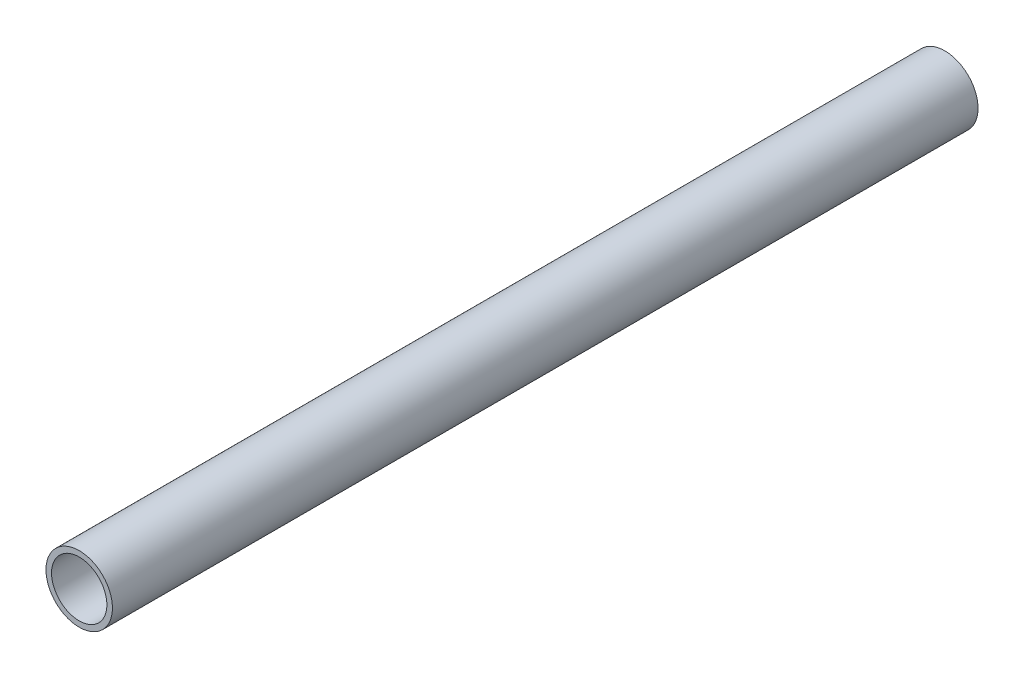
ISO-10303-21;
HEADER;
FILE_DESCRIPTION(('STEP AP214'),'2;1');
FILE_NAME('part.step','',(''),(''),'','','');
FILE_SCHEMA(('AUTOMOTIVE_DESIGN { 1 0 10303 214 1 1 1 1 }'));
ENDSEC;
DATA;
#1=APPLICATION_CONTEXT('core data for automotive mechanical design processes');
#2=APPLICATION_PROTOCOL_DEFINITION('international standard','automotive_design',2000,#1);
#3=PRODUCT_CONTEXT('',#1,'mechanical');
#4=PRODUCT('Part','Part','',(#3));
#5=PRODUCT_RELATED_PRODUCT_CATEGORY('part','',(#4));
#6=PRODUCT_DEFINITION_FORMATION('','',#4);
#7=PRODUCT_DEFINITION_CONTEXT('part definition',#1,'design');
#8=PRODUCT_DEFINITION('design','',#6,#7);
#9=PRODUCT_DEFINITION_SHAPE('','',#8);
#10=(LENGTH_UNIT() NAMED_UNIT(*) SI_UNIT(.MILLI.,.METRE.));
#11=(NAMED_UNIT(*) PLANE_ANGLE_UNIT() SI_UNIT($,.RADIAN.));
#12=(NAMED_UNIT(*) SI_UNIT($,.STERADIAN.) SOLID_ANGLE_UNIT());
#13=UNCERTAINTY_MEASURE_WITH_UNIT(LENGTH_MEASURE(1.E-05),#10,'distance_accuracy_value','');
#14=(GEOMETRIC_REPRESENTATION_CONTEXT(3) GLOBAL_UNCERTAINTY_ASSIGNED_CONTEXT((#13)) GLOBAL_UNIT_ASSIGNED_CONTEXT((#10,
#11,#12)) REPRESENTATION_CONTEXT('',''));
#15=CARTESIAN_POINT('',(0.,0.,0.));
#16=DIRECTION('',(0.,0.,1.));
#17=DIRECTION('',(1.,0.,0.));
#18=AXIS2_PLACEMENT_3D('',#15,#16,#17);
#19=CARTESIAN_POINT('',(0.,0.,391.));
#20=DIRECTION('',(0.,0.,1.));
#21=DIRECTION('',(1.,0.,0.));
#22=AXIS2_PLACEMENT_3D('',#19,#20,#21);
#23=PLANE('',#22);
#24=CARTESIAN_POINT('',(0.,0.,391.));
#25=DIRECTION('',(0.,0.,1.));
#26=DIRECTION('',(1.,0.,0.));
#27=AXIS2_PLACEMENT_3D('',#24,#25,#26);
#28=CIRCLE('',#27,15.);
#29=CARTESIAN_POINT('',(-15.,0.,391.));
#30=VERTEX_POINT('',#29);
#31=EDGE_CURVE('E10',#30,#30,#28,.T.);
#32=ORIENTED_EDGE('',*,*,#31,.T.);
#33=EDGE_LOOP('',(#32));
#34=FACE_BOUND('',#33,.T.);
#35=CARTESIAN_POINT('',(0.,0.,391.));
#36=DIRECTION('',(0.,0.,1.));
#37=DIRECTION('',(1.,0.,0.));
#38=AXIS2_PLACEMENT_3D('',#35,#36,#37);
#39=CIRCLE('',#38,12.5);
#40=CARTESIAN_POINT('',(-12.5,0.,391.));
#41=VERTEX_POINT('',#40);
#42=EDGE_CURVE('E48',#41,#41,#39,.T.);
#43=ORIENTED_EDGE('',*,*,#42,.F.);
#44=EDGE_LOOP('',(#43));
#45=FACE_BOUND('',#44,.T.);
#46=ADVANCED_FACE('F37',(#34,#45),#23,.T.);
#47=CARTESIAN_POINT('',(0.,0.,0.));
#48=DIRECTION('',(0.,0.,1.));
#49=DIRECTION('',(1.,0.,0.));
#50=AXIS2_PLACEMENT_3D('',#47,#48,#49);
#51=PLANE('',#50);
#52=CARTESIAN_POINT('',(0.,0.,0.));
#53=DIRECTION('',(0.,0.,1.));
#54=DIRECTION('',(1.,0.,0.));
#55=AXIS2_PLACEMENT_3D('',#52,#53,#54);
#56=CIRCLE('',#55,15.);
#57=CARTESIAN_POINT('',(-15.,0.,0.));
#58=VERTEX_POINT('',#57);
#59=EDGE_CURVE('E41',#58,#58,#56,.T.);
#60=ORIENTED_EDGE('',*,*,#59,.F.);
#61=EDGE_LOOP('',(#60));
#62=FACE_BOUND('',#61,.T.);
#63=CARTESIAN_POINT('',(0.,0.,0.));
#64=DIRECTION('',(0.,0.,1.));
#65=DIRECTION('',(1.,0.,0.));
#66=AXIS2_PLACEMENT_3D('',#63,#64,#65);
#67=CIRCLE('',#66,12.5);
#68=CARTESIAN_POINT('',(-12.5,0.,0.));
#69=VERTEX_POINT('',#68);
#70=EDGE_CURVE('E50',#69,#69,#67,.T.);
#71=ORIENTED_EDGE('',*,*,#70,.T.);
#72=EDGE_LOOP('',(#71));
#73=FACE_BOUND('',#72,.T.);
#74=ADVANCED_FACE('F60',(#62,#73),#51,.F.);
#75=CARTESIAN_POINT('',(0.,0.,391.));
#76=DIRECTION('',(0.,0.,-1.));
#77=DIRECTION('',(-1.,0.,0.));
#78=AXIS2_PLACEMENT_3D('',#75,#76,#77);
#79=CYLINDRICAL_SURFACE('',#78,15.);
#80=CARTESIAN_POINT('',(-15.,0.,391.));
#81=CARTESIAN_POINT('',(-15.,0.,386.927083333333));
#82=CARTESIAN_POINT('',(-15.,0.,382.854166666667));
#83=CARTESIAN_POINT('',(-15.,0.,374.708333333333));
#84=CARTESIAN_POINT('',(-15.,0.,370.635416666667));
#85=CARTESIAN_POINT('',(-15.,0.,362.489583333333));
#86=CARTESIAN_POINT('',(-15.,0.,358.416666666667));
#87=CARTESIAN_POINT('',(-15.,0.,350.270833333333));
#88=CARTESIAN_POINT('',(-15.,0.,346.197916666667));
#89=CARTESIAN_POINT('',(-15.,0.,338.052083333333));
#90=CARTESIAN_POINT('',(-15.,0.,333.979166666667));
#91=CARTESIAN_POINT('',(-15.,0.,325.833333333333));
#92=CARTESIAN_POINT('',(-15.,0.,321.760416666667));
#93=CARTESIAN_POINT('',(-15.,0.,313.614583333333));
#94=CARTESIAN_POINT('',(-15.,0.,309.541666666667));
#95=CARTESIAN_POINT('',(-15.,0.,301.395833333333));
#96=CARTESIAN_POINT('',(-15.,0.,297.322916666667));
#97=CARTESIAN_POINT('',(-15.,0.,289.177083333333));
#98=CARTESIAN_POINT('',(-15.,0.,285.104166666667));
#99=CARTESIAN_POINT('',(-15.,0.,276.958333333333));
#100=CARTESIAN_POINT('',(-15.,0.,272.885416666667));
#101=CARTESIAN_POINT('',(-15.,0.,264.739583333333));
#102=CARTESIAN_POINT('',(-15.,0.,260.666666666667));
#103=CARTESIAN_POINT('',(-15.,0.,252.520833333333));
#104=CARTESIAN_POINT('',(-15.,0.,248.447916666667));
#105=CARTESIAN_POINT('',(-15.,0.,240.302083333333));
#106=CARTESIAN_POINT('',(-15.,0.,236.229166666667));
#107=CARTESIAN_POINT('',(-15.,0.,228.083333333333));
#108=CARTESIAN_POINT('',(-15.,0.,224.010416666667));
#109=CARTESIAN_POINT('',(-15.,0.,215.864583333333));
#110=CARTESIAN_POINT('',(-15.,0.,211.791666666667));
#111=CARTESIAN_POINT('',(-15.,0.,203.645833333333));
#112=CARTESIAN_POINT('',(-15.,0.,199.572916666667));
#113=CARTESIAN_POINT('',(-15.,0.,191.427083333333));
#114=CARTESIAN_POINT('',(-15.,0.,187.354166666667));
#115=CARTESIAN_POINT('',(-15.,0.,179.208333333333));
#116=CARTESIAN_POINT('',(-15.,0.,175.135416666667));
#117=CARTESIAN_POINT('',(-15.,0.,166.989583333333));
#118=CARTESIAN_POINT('',(-15.,0.,162.916666666667));
#119=CARTESIAN_POINT('',(-15.,0.,154.770833333333));
#120=CARTESIAN_POINT('',(-15.,0.,150.697916666667));
#121=CARTESIAN_POINT('',(-15.,0.,142.552083333333));
#122=CARTESIAN_POINT('',(-15.,0.,138.479166666667));
#123=CARTESIAN_POINT('',(-15.,0.,130.333333333333));
#124=CARTESIAN_POINT('',(-15.,0.,126.260416666667));
#125=CARTESIAN_POINT('',(-15.,0.,118.114583333333));
#126=CARTESIAN_POINT('',(-15.,0.,114.041666666667));
#127=CARTESIAN_POINT('',(-15.,0.,105.895833333333));
#128=CARTESIAN_POINT('',(-15.,0.,101.822916666667));
#129=CARTESIAN_POINT('',(-15.,0.,93.6770833333333));
#130=CARTESIAN_POINT('',(-15.,0.,89.6041666666666));
#131=CARTESIAN_POINT('',(-15.,0.,81.4583333333333));
#132=CARTESIAN_POINT('',(-15.,0.,77.3854166666666));
#133=CARTESIAN_POINT('',(-15.,0.,69.2395833333333));
#134=CARTESIAN_POINT('',(-15.,0.,65.1666666666666));
#135=CARTESIAN_POINT('',(-15.,0.,57.0208333333333));
#136=CARTESIAN_POINT('',(-15.,0.,52.9479166666666));
#137=CARTESIAN_POINT('',(-15.,0.,44.8020833333333));
#138=CARTESIAN_POINT('',(-15.,0.,40.7291666666666));
#139=CARTESIAN_POINT('',(-15.,0.,32.5833333333333));
#140=CARTESIAN_POINT('',(-15.,0.,28.5104166666666));
#141=CARTESIAN_POINT('',(-15.,0.,20.3645833333333));
#142=CARTESIAN_POINT('',(-15.,0.,16.2916666666666));
#143=CARTESIAN_POINT('',(-15.,0.,8.14583333333328));
#144=CARTESIAN_POINT('',(-15.,0.,4.07291666666661));
#145=CARTESIAN_POINT('',(-15.,0.,0.));
#146=B_SPLINE_CURVE_WITH_KNOTS('',3,(#80,#81,#82,#83,#84,#85,#86,#87,#88,#89,#90,#91,#92,#93,
#94,#95,#96,#97,#98,#99,#100,#101,#102,#103,#104,#105,#106,#107,#108,#109,#110,#111,#112,#113,
#114,#115,#116,#117,#118,#119,#120,#121,#122,#123,#124,#125,#126,#127,#128,#129,#130,#131,#132,
#133,#134,#135,#136,#137,#138,#139,#140,#141,#142,#143,#144,#145),.UNSPECIFIED.,.F.,.F.,(4,2,2,
2,2,2,2,2,2,2,2,2,2,2,2,2,2,2,2,2,2,2,2,2,2,2,2,2,2,2,2,2,4),(0.,12.2187499999999,
24.4374999999999,36.6562499999999,48.8749999999999,61.0937499999999,73.3124999999999,
85.5312499999999,97.7499999999999,109.96875,122.1875,134.40625,146.625,158.84375,171.0625,
183.28125,195.5,207.71875,219.9375,232.15625,244.375,256.59375,268.8125,281.03125,293.25,
305.46875,317.6875,329.90625,342.125,354.34375,366.5625,378.78125,391.),.UNSPECIFIED.);
#147=EDGE_CURVE('BSEAM39',#30,#58,#146,.T.);
#148=ORIENTED_EDGE('',*,*,#31,.F.);
#149=ORIENTED_EDGE('',*,*,#59,.T.);
#150=ORIENTED_EDGE('',*,*,#147,.T.);
#151=ORIENTED_EDGE('',*,*,#147,.F.);
#152=EDGE_LOOP('',(#148,#150,#149,#151));
#153=FACE_BOUND('',#152,.T.);
#154=ADVANCED_FACE('F39',(#153),#79,.T.);
#155=CARTESIAN_POINT('',(0.,0.,391.));
#156=DIRECTION('',(0.,0.,-1.));
#157=DIRECTION('',(-1.,0.,0.));
#158=AXIS2_PLACEMENT_3D('',#155,#156,#157);
#159=CYLINDRICAL_SURFACE('',#158,12.5);
#160=CARTESIAN_POINT('',(-12.5,0.,391.));
#161=CARTESIAN_POINT('',(-12.5,0.,386.927083333333));
#162=CARTESIAN_POINT('',(-12.5,0.,382.854166666667));
#163=CARTESIAN_POINT('',(-12.5,0.,374.708333333333));
#164=CARTESIAN_POINT('',(-12.5,0.,370.635416666667));
#165=CARTESIAN_POINT('',(-12.5,0.,362.489583333333));
#166=CARTESIAN_POINT('',(-12.5,0.,358.416666666667));
#167=CARTESIAN_POINT('',(-12.5,0.,350.270833333333));
#168=CARTESIAN_POINT('',(-12.5,0.,346.197916666667));
#169=CARTESIAN_POINT('',(-12.5,0.,338.052083333333));
#170=CARTESIAN_POINT('',(-12.5,0.,333.979166666667));
#171=CARTESIAN_POINT('',(-12.5,0.,325.833333333333));
#172=CARTESIAN_POINT('',(-12.5,0.,321.760416666667));
#173=CARTESIAN_POINT('',(-12.5,0.,313.614583333333));
#174=CARTESIAN_POINT('',(-12.5,0.,309.541666666667));
#175=CARTESIAN_POINT('',(-12.5,0.,301.395833333333));
#176=CARTESIAN_POINT('',(-12.5,0.,297.322916666667));
#177=CARTESIAN_POINT('',(-12.5,0.,289.177083333333));
#178=CARTESIAN_POINT('',(-12.5,0.,285.104166666667));
#179=CARTESIAN_POINT('',(-12.5,0.,276.958333333333));
#180=CARTESIAN_POINT('',(-12.5,0.,272.885416666667));
#181=CARTESIAN_POINT('',(-12.5,0.,264.739583333333));
#182=CARTESIAN_POINT('',(-12.5,0.,260.666666666667));
#183=CARTESIAN_POINT('',(-12.5,0.,252.520833333333));
#184=CARTESIAN_POINT('',(-12.5,0.,248.447916666667));
#185=CARTESIAN_POINT('',(-12.5,0.,240.302083333333));
#186=CARTESIAN_POINT('',(-12.5,0.,236.229166666667));
#187=CARTESIAN_POINT('',(-12.5,0.,228.083333333333));
#188=CARTESIAN_POINT('',(-12.5,0.,224.010416666667));
#189=CARTESIAN_POINT('',(-12.5,0.,215.864583333333));
#190=CARTESIAN_POINT('',(-12.5,0.,211.791666666667));
#191=CARTESIAN_POINT('',(-12.5,0.,203.645833333333));
#192=CARTESIAN_POINT('',(-12.5,0.,199.572916666667));
#193=CARTESIAN_POINT('',(-12.5,0.,191.427083333333));
#194=CARTESIAN_POINT('',(-12.5,0.,187.354166666667));
#195=CARTESIAN_POINT('',(-12.5,0.,179.208333333333));
#196=CARTESIAN_POINT('',(-12.5,0.,175.135416666667));
#197=CARTESIAN_POINT('',(-12.5,0.,166.989583333333));
#198=CARTESIAN_POINT('',(-12.5,0.,162.916666666667));
#199=CARTESIAN_POINT('',(-12.5,0.,154.770833333333));
#200=CARTESIAN_POINT('',(-12.5,0.,150.697916666667));
#201=CARTESIAN_POINT('',(-12.5,0.,142.552083333333));
#202=CARTESIAN_POINT('',(-12.5,0.,138.479166666667));
#203=CARTESIAN_POINT('',(-12.5,0.,130.333333333333));
#204=CARTESIAN_POINT('',(-12.5,0.,126.260416666667));
#205=CARTESIAN_POINT('',(-12.5,0.,118.114583333333));
#206=CARTESIAN_POINT('',(-12.5,0.,114.041666666667));
#207=CARTESIAN_POINT('',(-12.5,0.,105.895833333333));
#208=CARTESIAN_POINT('',(-12.5,0.,101.822916666667));
#209=CARTESIAN_POINT('',(-12.5,0.,93.6770833333333));
#210=CARTESIAN_POINT('',(-12.5,0.,89.6041666666666));
#211=CARTESIAN_POINT('',(-12.5,0.,81.4583333333333));
#212=CARTESIAN_POINT('',(-12.5,0.,77.3854166666666));
#213=CARTESIAN_POINT('',(-12.5,0.,69.2395833333333));
#214=CARTESIAN_POINT('',(-12.5,0.,65.1666666666666));
#215=CARTESIAN_POINT('',(-12.5,0.,57.0208333333333));
#216=CARTESIAN_POINT('',(-12.5,0.,52.9479166666666));
#217=CARTESIAN_POINT('',(-12.5,0.,44.8020833333333));
#218=CARTESIAN_POINT('',(-12.5,0.,40.7291666666666));
#219=CARTESIAN_POINT('',(-12.5,0.,32.5833333333333));
#220=CARTESIAN_POINT('',(-12.5,0.,28.5104166666666));
#221=CARTESIAN_POINT('',(-12.5,0.,20.3645833333333));
#222=CARTESIAN_POINT('',(-12.5,0.,16.2916666666666));
#223=CARTESIAN_POINT('',(-12.5,0.,8.14583333333328));
#224=CARTESIAN_POINT('',(-12.5,0.,4.07291666666661));
#225=CARTESIAN_POINT('',(-12.5,0.,0.));
#226=B_SPLINE_CURVE_WITH_KNOTS('',3,(#160,#161,#162,#163,#164,#165,#166,#167,#168,#169,#170,
#171,#172,#173,#174,#175,#176,#177,#178,#179,#180,#181,#182,#183,#184,#185,#186,#187,#188,#189,
#190,#191,#192,#193,#194,#195,#196,#197,#198,#199,#200,#201,#202,#203,#204,#205,#206,#207,#208,
#209,#210,#211,#212,#213,#214,#215,#216,#217,#218,#219,#220,#221,#222,#223,#224,#225),
.UNSPECIFIED.,.F.,.F.,(4,2,2,2,2,2,2,2,2,2,2,2,2,2,2,2,2,2,2,2,2,2,2,2,2,2,2,2,2,2,2,2,4),(0.,
12.21875,24.4375,36.65625,48.875,61.09375,73.3125,85.53125,97.75,109.96875,122.1875,134.40625,
146.625,158.84375,171.0625,183.28125,195.5,207.71875,219.9375,232.15625,244.375,256.59375,
268.8125,281.03125,293.25,305.46875,317.6875,329.90625,342.125,354.34375,366.5625,378.78125,
391.),.UNSPECIFIED.);
#227=EDGE_CURVE('BSEAM56',#41,#69,#226,.T.);
#228=ORIENTED_EDGE('',*,*,#42,.T.);
#229=ORIENTED_EDGE('',*,*,#70,.F.);
#230=ORIENTED_EDGE('',*,*,#227,.T.);
#231=ORIENTED_EDGE('',*,*,#227,.F.);
#232=EDGE_LOOP('',(#228,#230,#229,#231));
#233=FACE_BOUND('',#232,.T.);
#234=ADVANCED_FACE('F56',(#233),#159,.F.);
#235=CLOSED_SHELL('',(#46,#74,#154,#234));
#236=MANIFOLD_SOLID_BREP('B2',#235);
#237=ADVANCED_BREP_SHAPE_REPRESENTATION('',(#18,#236),#14);
#238=SHAPE_DEFINITION_REPRESENTATION(#9,#237);
ENDSEC;
END-ISO-10303-21;
